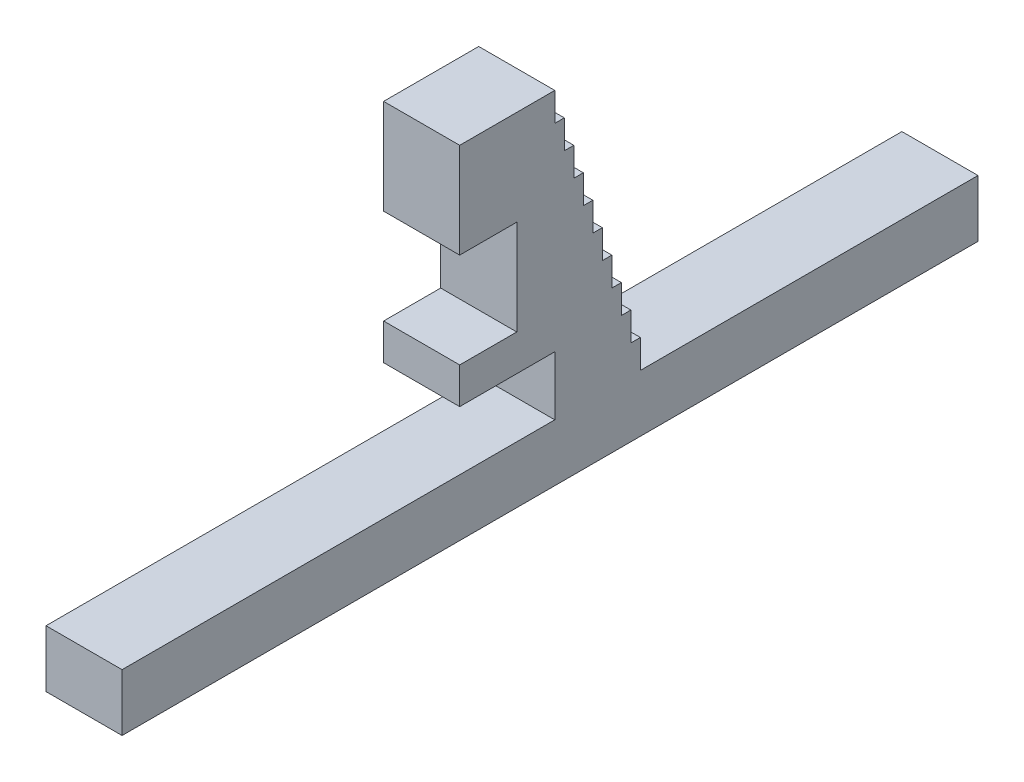
ISO-10303-21;
HEADER;
FILE_DESCRIPTION(('STEP AP214'),'2;1');
FILE_NAME('part.step','',(''),(''),'','','');
FILE_SCHEMA(('AUTOMOTIVE_DESIGN { 1 0 10303 214 1 1 1 1 }'));
ENDSEC;
DATA;
#1=APPLICATION_CONTEXT('core data for automotive mechanical design processes');
#2=APPLICATION_PROTOCOL_DEFINITION('international standard','automotive_design',2000,#1);
#3=PRODUCT_CONTEXT('',#1,'mechanical');
#4=PRODUCT('Part','Part','',(#3));
#5=PRODUCT_RELATED_PRODUCT_CATEGORY('part','',(#4));
#6=PRODUCT_DEFINITION_FORMATION('','',#4);
#7=PRODUCT_DEFINITION_CONTEXT('part definition',#1,'design');
#8=PRODUCT_DEFINITION('design','',#6,#7);
#9=PRODUCT_DEFINITION_SHAPE('','',#8);
#10=(LENGTH_UNIT() NAMED_UNIT(*) SI_UNIT(.MILLI.,.METRE.));
#11=(NAMED_UNIT(*) PLANE_ANGLE_UNIT() SI_UNIT($,.RADIAN.));
#12=(NAMED_UNIT(*) SI_UNIT($,.STERADIAN.) SOLID_ANGLE_UNIT());
#13=UNCERTAINTY_MEASURE_WITH_UNIT(LENGTH_MEASURE(1.E-05),#10,'distance_accuracy_value','');
#14=(GEOMETRIC_REPRESENTATION_CONTEXT(3) GLOBAL_UNCERTAINTY_ASSIGNED_CONTEXT((#13)) GLOBAL_UNIT_ASSIGNED_CONTEXT((#10,
#11,#12)) REPRESENTATION_CONTEXT('',''));
#15=CARTESIAN_POINT('',(0.,0.,0.));
#16=DIRECTION('',(0.,0.,1.));
#17=DIRECTION('',(1.,0.,0.));
#18=AXIS2_PLACEMENT_3D('',#15,#16,#17);
#19=CARTESIAN_POINT('',(4.,1.5,-4.));
#20=DIRECTION('',(0.,0.,1.));
#21=DIRECTION('',(0.,-1.,0.));
#22=AXIS2_PLACEMENT_3D('',#19,#20,#21);
#23=PLANE('',#22);
#24=DIRECTION('',(0.,1.,0.));
#25=VECTOR('',#24,1.);
#26=CARTESIAN_POINT('',(0.,1.5,-4.));
#27=LINE('',#26,#25);
#28=CARTESIAN_POINT('',(0.,0.,-4.));
#29=VERTEX_POINT('',#28);
#30=CARTESIAN_POINT('',(0.,1.5,-4.));
#31=VERTEX_POINT('',#30);
#32=EDGE_CURVE('E273',#29,#31,#27,.T.);
#33=ORIENTED_EDGE('',*,*,#32,.T.);
#34=DIRECTION('',(-1.,0.,0.));
#35=VECTOR('',#34,1.);
#36=CARTESIAN_POINT('',(4.,1.5,-4.));
#37=LINE('',#36,#35);
#38=CARTESIAN_POINT('',(4.,1.5,-4.));
#39=VERTEX_POINT('',#38);
#40=EDGE_CURVE('E11',#39,#31,#37,.T.);
#41=ORIENTED_EDGE('',*,*,#40,.F.);
#42=DIRECTION('',(0.,1.,0.));
#43=VECTOR('',#42,1.);
#44=CARTESIAN_POINT('',(4.,1.5,-4.));
#45=LINE('',#44,#43);
#46=CARTESIAN_POINT('',(4.,0.,-4.));
#47=VERTEX_POINT('',#46);
#48=EDGE_CURVE('E336',#47,#39,#45,.T.);
#49=ORIENTED_EDGE('',*,*,#48,.F.);
#50=DIRECTION('',(-1.,0.,0.));
#51=VECTOR('',#50,1.);
#52=CARTESIAN_POINT('',(4.,0.,-4.));
#53=LINE('',#52,#51);
#54=EDGE_CURVE('E269',#47,#29,#53,.T.);
#55=ORIENTED_EDGE('',*,*,#54,.T.);
#56=EDGE_LOOP('',(#33,#41,#49,#55));
#57=FACE_BOUND('',#56,.T.);
#58=ADVANCED_FACE('F33',(#57),#23,.F.);
#59=CARTESIAN_POINT('',(4.,1.5,-3.5));
#60=DIRECTION('',(0.,-1.,0.));
#61=DIRECTION('',(0.,0.,-1.));
#62=AXIS2_PLACEMENT_3D('',#59,#60,#61);
#63=PLANE('',#62);
#64=DIRECTION('',(0.,0.,1.));
#65=VECTOR('',#64,1.);
#66=CARTESIAN_POINT('',(0.,1.5,-3.5));
#67=LINE('',#66,#65);
#68=CARTESIAN_POINT('',(0.,1.5,-3.5));
#69=VERTEX_POINT('',#68);
#70=EDGE_CURVE('E276',#31,#69,#67,.T.);
#71=ORIENTED_EDGE('',*,*,#70,.T.);
#72=DIRECTION('',(-1.,0.,0.));
#73=VECTOR('',#72,1.);
#74=CARTESIAN_POINT('',(4.,1.5,-3.5));
#75=LINE('',#74,#73);
#76=CARTESIAN_POINT('',(4.,1.5,-3.5));
#77=VERTEX_POINT('',#76);
#78=EDGE_CURVE('E41',#77,#69,#75,.T.);
#79=ORIENTED_EDGE('',*,*,#78,.F.);
#80=DIRECTION('',(0.,0.,1.));
#81=VECTOR('',#80,1.);
#82=CARTESIAN_POINT('',(4.,1.5,-3.5));
#83=LINE('',#82,#81);
#84=EDGE_CURVE('E164',#39,#77,#83,.T.);
#85=ORIENTED_EDGE('',*,*,#84,.F.);
#86=ORIENTED_EDGE('',*,*,#40,.T.);
#87=EDGE_LOOP('',(#71,#79,#85,#86));
#88=FACE_BOUND('',#87,.T.);
#89=ADVANCED_FACE('F513',(#88),#63,.F.);
#90=CARTESIAN_POINT('',(4.,3.,-3.5));
#91=DIRECTION('',(0.,0.,1.));
#92=DIRECTION('',(1.,0.,0.));
#93=AXIS2_PLACEMENT_3D('',#90,#91,#92);
#94=PLANE('',#93);
#95=DIRECTION('',(0.,1.,0.));
#96=VECTOR('',#95,1.);
#97=CARTESIAN_POINT('',(0.,3.,-3.5));
#98=LINE('',#97,#96);
#99=CARTESIAN_POINT('',(0.,3.,-3.5));
#100=VERTEX_POINT('',#99);
#101=EDGE_CURVE('E278',#69,#100,#98,.T.);
#102=ORIENTED_EDGE('',*,*,#101,.T.);
#103=DIRECTION('',(-1.,0.,0.));
#104=VECTOR('',#103,1.);
#105=CARTESIAN_POINT('',(4.,3.,-3.5));
#106=LINE('',#105,#104);
#107=CARTESIAN_POINT('',(4.,3.,-3.5));
#108=VERTEX_POINT('',#107);
#109=EDGE_CURVE('E415',#108,#100,#106,.T.);
#110=ORIENTED_EDGE('',*,*,#109,.F.);
#111=DIRECTION('',(0.,1.,0.));
#112=VECTOR('',#111,1.);
#113=CARTESIAN_POINT('',(4.,3.,-3.5));
#114=LINE('',#113,#112);
#115=EDGE_CURVE('E423',#77,#108,#114,.T.);
#116=ORIENTED_EDGE('',*,*,#115,.F.);
#117=ORIENTED_EDGE('',*,*,#78,.T.);
#118=EDGE_LOOP('',(#102,#110,#116,#117));
#119=FACE_BOUND('',#118,.T.);
#120=ADVANCED_FACE('F421',(#119),#94,.F.);
#121=CARTESIAN_POINT('',(4.,3.,-3.));
#122=DIRECTION('',(0.,-1.,0.));
#123=DIRECTION('',(0.,0.,-1.));
#124=AXIS2_PLACEMENT_3D('',#121,#122,#123);
#125=PLANE('',#124);
#126=DIRECTION('',(0.,0.,1.));
#127=VECTOR('',#126,1.);
#128=CARTESIAN_POINT('',(0.,3.,-3.));
#129=LINE('',#128,#127);
#130=CARTESIAN_POINT('',(0.,3.,-3.));
#131=VERTEX_POINT('',#130);
#132=EDGE_CURVE('E280',#100,#131,#129,.T.);
#133=ORIENTED_EDGE('',*,*,#132,.T.);
#134=DIRECTION('',(-1.,0.,0.));
#135=VECTOR('',#134,1.);
#136=CARTESIAN_POINT('',(4.,3.,-3.));
#137=LINE('',#136,#135);
#138=CARTESIAN_POINT('',(4.,3.,-3.));
#139=VERTEX_POINT('',#138);
#140=EDGE_CURVE('E412',#139,#131,#137,.T.);
#141=ORIENTED_EDGE('',*,*,#140,.F.);
#142=DIRECTION('',(0.,0.,1.));
#143=VECTOR('',#142,1.);
#144=CARTESIAN_POINT('',(4.,3.,-3.));
#145=LINE('',#144,#143);
#146=EDGE_CURVE('E441',#108,#139,#145,.T.);
#147=ORIENTED_EDGE('',*,*,#146,.F.);
#148=ORIENTED_EDGE('',*,*,#109,.T.);
#149=EDGE_LOOP('',(#133,#141,#147,#148));
#150=FACE_BOUND('',#149,.T.);
#151=ADVANCED_FACE('F432',(#150),#125,.F.);
#152=CARTESIAN_POINT('',(4.,4.5,-3.));
#153=DIRECTION('',(0.,0.,1.));
#154=DIRECTION('',(0.,-1.,0.));
#155=AXIS2_PLACEMENT_3D('',#152,#153,#154);
#156=PLANE('',#155);
#157=DIRECTION('',(0.,1.,0.));
#158=VECTOR('',#157,1.);
#159=CARTESIAN_POINT('',(0.,4.5,-3.));
#160=LINE('',#159,#158);
#161=CARTESIAN_POINT('',(0.,4.5,-3.));
#162=VERTEX_POINT('',#161);
#163=EDGE_CURVE('E282',#131,#162,#160,.T.);
#164=ORIENTED_EDGE('',*,*,#163,.T.);
#165=DIRECTION('',(-1.,0.,0.));
#166=VECTOR('',#165,1.);
#167=CARTESIAN_POINT('',(4.,4.5,-3.));
#168=LINE('',#167,#166);
#169=CARTESIAN_POINT('',(4.,4.5,-3.));
#170=VERTEX_POINT('',#169);
#171=EDGE_CURVE('E409',#170,#162,#168,.T.);
#172=ORIENTED_EDGE('',*,*,#171,.F.);
#173=DIRECTION('',(0.,1.,0.));
#174=VECTOR('',#173,1.);
#175=CARTESIAN_POINT('',(4.,4.5,-3.));
#176=LINE('',#175,#174);
#177=EDGE_CURVE('E438',#139,#170,#176,.T.);
#178=ORIENTED_EDGE('',*,*,#177,.F.);
#179=ORIENTED_EDGE('',*,*,#140,.T.);
#180=EDGE_LOOP('',(#164,#172,#178,#179));
#181=FACE_BOUND('',#180,.T.);
#182=ADVANCED_FACE('F436',(#181),#156,.F.);
#183=CARTESIAN_POINT('',(4.,4.5,-2.5));
#184=DIRECTION('',(0.,-1.,0.));
#185=DIRECTION('',(0.,0.,-1.));
#186=AXIS2_PLACEMENT_3D('',#183,#184,#185);
#187=PLANE('',#186);
#188=DIRECTION('',(0.,0.,1.));
#189=VECTOR('',#188,1.);
#190=CARTESIAN_POINT('',(0.,4.5,-2.5));
#191=LINE('',#190,#189);
#192=CARTESIAN_POINT('',(0.,4.5,-2.5));
#193=VERTEX_POINT('',#192);
#194=EDGE_CURVE('E284',#162,#193,#191,.T.);
#195=ORIENTED_EDGE('',*,*,#194,.T.);
#196=DIRECTION('',(-1.,0.,0.));
#197=VECTOR('',#196,1.);
#198=CARTESIAN_POINT('',(4.,4.5,-2.5));
#199=LINE('',#198,#197);
#200=CARTESIAN_POINT('',(4.,4.5,-2.5));
#201=VERTEX_POINT('',#200);
#202=EDGE_CURVE('E406',#201,#193,#199,.T.);
#203=ORIENTED_EDGE('',*,*,#202,.F.);
#204=DIRECTION('',(0.,0.,1.));
#205=VECTOR('',#204,1.);
#206=CARTESIAN_POINT('',(4.,4.5,-2.5));
#207=LINE('',#206,#205);
#208=EDGE_CURVE('E440',#170,#201,#207,.T.);
#209=ORIENTED_EDGE('',*,*,#208,.F.);
#210=ORIENTED_EDGE('',*,*,#171,.T.);
#211=EDGE_LOOP('',(#195,#203,#209,#210));
#212=FACE_BOUND('',#211,.T.);
#213=ADVANCED_FACE('F526',(#212),#187,.F.);
#214=CARTESIAN_POINT('',(4.,6.,-2.5));
#215=DIRECTION('',(0.,0.,1.));
#216=DIRECTION('',(0.,-1.,0.));
#217=AXIS2_PLACEMENT_3D('',#214,#215,#216);
#218=PLANE('',#217);
#219=DIRECTION('',(0.,1.,0.));
#220=VECTOR('',#219,1.);
#221=CARTESIAN_POINT('',(0.,6.,-2.5));
#222=LINE('',#221,#220);
#223=CARTESIAN_POINT('',(0.,6.,-2.5));
#224=VERTEX_POINT('',#223);
#225=EDGE_CURVE('E286',#193,#224,#222,.T.);
#226=ORIENTED_EDGE('',*,*,#225,.T.);
#227=DIRECTION('',(-1.,0.,0.));
#228=VECTOR('',#227,1.);
#229=CARTESIAN_POINT('',(4.,6.,-2.5));
#230=LINE('',#229,#228);
#231=CARTESIAN_POINT('',(4.,6.,-2.5));
#232=VERTEX_POINT('',#231);
#233=EDGE_CURVE('E403',#232,#224,#230,.T.);
#234=ORIENTED_EDGE('',*,*,#233,.F.);
#235=DIRECTION('',(0.,1.,0.));
#236=VECTOR('',#235,1.);
#237=CARTESIAN_POINT('',(4.,6.,-2.5));
#238=LINE('',#237,#236);
#239=EDGE_CURVE('E443',#201,#232,#238,.T.);
#240=ORIENTED_EDGE('',*,*,#239,.F.);
#241=ORIENTED_EDGE('',*,*,#202,.T.);
#242=EDGE_LOOP('',(#226,#234,#240,#241));
#243=FACE_BOUND('',#242,.T.);
#244=ADVANCED_FACE('F529',(#243),#218,.F.);
#245=CARTESIAN_POINT('',(4.,6.,-2.));
#246=DIRECTION('',(0.,-1.,0.));
#247=DIRECTION('',(0.,0.,-1.));
#248=AXIS2_PLACEMENT_3D('',#245,#246,#247);
#249=PLANE('',#248);
#250=DIRECTION('',(0.,0.,1.));
#251=VECTOR('',#250,1.);
#252=CARTESIAN_POINT('',(0.,6.,-2.));
#253=LINE('',#252,#251);
#254=CARTESIAN_POINT('',(0.,6.,-2.));
#255=VERTEX_POINT('',#254);
#256=EDGE_CURVE('E288',#224,#255,#253,.T.);
#257=ORIENTED_EDGE('',*,*,#256,.T.);
#258=DIRECTION('',(-1.,0.,0.));
#259=VECTOR('',#258,1.);
#260=CARTESIAN_POINT('',(4.,6.,-2.));
#261=LINE('',#260,#259);
#262=CARTESIAN_POINT('',(4.,6.,-2.));
#263=VERTEX_POINT('',#262);
#264=EDGE_CURVE('E400',#263,#255,#261,.T.);
#265=ORIENTED_EDGE('',*,*,#264,.F.);
#266=DIRECTION('',(0.,0.,1.));
#267=VECTOR('',#266,1.);
#268=CARTESIAN_POINT('',(4.,6.,-2.));
#269=LINE('',#268,#267);
#270=EDGE_CURVE('E449',#232,#263,#269,.T.);
#271=ORIENTED_EDGE('',*,*,#270,.F.);
#272=ORIENTED_EDGE('',*,*,#233,.T.);
#273=EDGE_LOOP('',(#257,#265,#271,#272));
#274=FACE_BOUND('',#273,.T.);
#275=ADVANCED_FACE('F533',(#274),#249,.F.);
#276=CARTESIAN_POINT('',(4.,7.5,-2.));
#277=DIRECTION('',(0.,0.,1.));
#278=DIRECTION('',(0.,-1.,0.));
#279=AXIS2_PLACEMENT_3D('',#276,#277,#278);
#280=PLANE('',#279);
#281=DIRECTION('',(0.,1.,0.));
#282=VECTOR('',#281,1.);
#283=CARTESIAN_POINT('',(0.,7.5,-2.));
#284=LINE('',#283,#282);
#285=CARTESIAN_POINT('',(0.,7.5,-2.));
#286=VERTEX_POINT('',#285);
#287=EDGE_CURVE('E290',#255,#286,#284,.T.);
#288=ORIENTED_EDGE('',*,*,#287,.T.);
#289=DIRECTION('',(-1.,0.,0.));
#290=VECTOR('',#289,1.);
#291=CARTESIAN_POINT('',(4.,7.5,-2.));
#292=LINE('',#291,#290);
#293=CARTESIAN_POINT('',(4.,7.5,-2.));
#294=VERTEX_POINT('',#293);
#295=EDGE_CURVE('E397',#294,#286,#292,.T.);
#296=ORIENTED_EDGE('',*,*,#295,.F.);
#297=DIRECTION('',(0.,1.,0.));
#298=VECTOR('',#297,1.);
#299=CARTESIAN_POINT('',(4.,7.5,-2.));
#300=LINE('',#299,#298);
#301=EDGE_CURVE('E451',#263,#294,#300,.T.);
#302=ORIENTED_EDGE('',*,*,#301,.F.);
#303=ORIENTED_EDGE('',*,*,#264,.T.);
#304=EDGE_LOOP('',(#288,#296,#302,#303));
#305=FACE_BOUND('',#304,.T.);
#306=ADVANCED_FACE('F537',(#305),#280,.F.);
#307=CARTESIAN_POINT('',(4.,7.5,-1.5));
#308=DIRECTION('',(0.,-1.,0.));
#309=DIRECTION('',(0.,0.,-1.));
#310=AXIS2_PLACEMENT_3D('',#307,#308,#309);
#311=PLANE('',#310);
#312=DIRECTION('',(0.,0.,1.));
#313=VECTOR('',#312,1.);
#314=CARTESIAN_POINT('',(0.,7.5,-1.5));
#315=LINE('',#314,#313);
#316=CARTESIAN_POINT('',(0.,7.5,-1.5));
#317=VERTEX_POINT('',#316);
#318=EDGE_CURVE('E292',#286,#317,#315,.T.);
#319=ORIENTED_EDGE('',*,*,#318,.T.);
#320=DIRECTION('',(-1.,0.,0.));
#321=VECTOR('',#320,1.);
#322=CARTESIAN_POINT('',(4.,7.5,-1.5));
#323=LINE('',#322,#321);
#324=CARTESIAN_POINT('',(4.,7.5,-1.5));
#325=VERTEX_POINT('',#324);
#326=EDGE_CURVE('E394',#325,#317,#323,.T.);
#327=ORIENTED_EDGE('',*,*,#326,.F.);
#328=DIRECTION('',(0.,0.,1.));
#329=VECTOR('',#328,1.);
#330=CARTESIAN_POINT('',(4.,7.5,-1.5));
#331=LINE('',#330,#329);
#332=EDGE_CURVE('E453',#294,#325,#331,.T.);
#333=ORIENTED_EDGE('',*,*,#332,.F.);
#334=ORIENTED_EDGE('',*,*,#295,.T.);
#335=EDGE_LOOP('',(#319,#327,#333,#334));
#336=FACE_BOUND('',#335,.T.);
#337=ADVANCED_FACE('F541',(#336),#311,.F.);
#338=CARTESIAN_POINT('',(4.,9.,-1.5));
#339=DIRECTION('',(0.,0.,1.));
#340=DIRECTION('',(0.,-1.,0.));
#341=AXIS2_PLACEMENT_3D('',#338,#339,#340);
#342=PLANE('',#341);
#343=DIRECTION('',(0.,1.,0.));
#344=VECTOR('',#343,1.);
#345=CARTESIAN_POINT('',(0.,9.,-1.5));
#346=LINE('',#345,#344);
#347=CARTESIAN_POINT('',(0.,9.,-1.5));
#348=VERTEX_POINT('',#347);
#349=EDGE_CURVE('E294',#317,#348,#346,.T.);
#350=ORIENTED_EDGE('',*,*,#349,.T.);
#351=DIRECTION('',(-1.,0.,0.));
#352=VECTOR('',#351,1.);
#353=CARTESIAN_POINT('',(4.,9.,-1.5));
#354=LINE('',#353,#352);
#355=CARTESIAN_POINT('',(4.,9.,-1.5));
#356=VERTEX_POINT('',#355);
#357=EDGE_CURVE('E391',#356,#348,#354,.T.);
#358=ORIENTED_EDGE('',*,*,#357,.F.);
#359=DIRECTION('',(0.,1.,0.));
#360=VECTOR('',#359,1.);
#361=CARTESIAN_POINT('',(4.,9.,-1.5));
#362=LINE('',#361,#360);
#363=EDGE_CURVE('E455',#325,#356,#362,.T.);
#364=ORIENTED_EDGE('',*,*,#363,.F.);
#365=ORIENTED_EDGE('',*,*,#326,.T.);
#366=EDGE_LOOP('',(#350,#358,#364,#365));
#367=FACE_BOUND('',#366,.T.);
#368=ADVANCED_FACE('F545',(#367),#342,.F.);
#369=CARTESIAN_POINT('',(4.,9.,-1.));
#370=DIRECTION('',(0.,-1.,0.));
#371=DIRECTION('',(0.,0.,-1.));
#372=AXIS2_PLACEMENT_3D('',#369,#370,#371);
#373=PLANE('',#372);
#374=DIRECTION('',(0.,0.,1.));
#375=VECTOR('',#374,1.);
#376=CARTESIAN_POINT('',(0.,9.,-1.));
#377=LINE('',#376,#375);
#378=CARTESIAN_POINT('',(0.,9.,-1.));
#379=VERTEX_POINT('',#378);
#380=EDGE_CURVE('E296',#348,#379,#377,.T.);
#381=ORIENTED_EDGE('',*,*,#380,.T.);
#382=DIRECTION('',(-1.,0.,0.));
#383=VECTOR('',#382,1.);
#384=CARTESIAN_POINT('',(4.,9.,-1.));
#385=LINE('',#384,#383);
#386=CARTESIAN_POINT('',(4.,9.,-1.));
#387=VERTEX_POINT('',#386);
#388=EDGE_CURVE('E388',#387,#379,#385,.T.);
#389=ORIENTED_EDGE('',*,*,#388,.F.);
#390=DIRECTION('',(0.,0.,1.));
#391=VECTOR('',#390,1.);
#392=CARTESIAN_POINT('',(4.,9.,-1.));
#393=LINE('',#392,#391);
#394=EDGE_CURVE('E457',#356,#387,#393,.T.);
#395=ORIENTED_EDGE('',*,*,#394,.F.);
#396=ORIENTED_EDGE('',*,*,#357,.T.);
#397=EDGE_LOOP('',(#381,#389,#395,#396));
#398=FACE_BOUND('',#397,.T.);
#399=ADVANCED_FACE('F549',(#398),#373,.F.);
#400=CARTESIAN_POINT('',(4.,10.5,-1.));
#401=DIRECTION('',(0.,0.,1.));
#402=DIRECTION('',(1.,0.,0.));
#403=AXIS2_PLACEMENT_3D('',#400,#401,#402);
#404=PLANE('',#403);
#405=DIRECTION('',(0.,1.,0.));
#406=VECTOR('',#405,1.);
#407=CARTESIAN_POINT('',(0.,10.5,-1.));
#408=LINE('',#407,#406);
#409=CARTESIAN_POINT('',(0.,10.5,-1.));
#410=VERTEX_POINT('',#409);
#411=EDGE_CURVE('E298',#379,#410,#408,.T.);
#412=ORIENTED_EDGE('',*,*,#411,.T.);
#413=DIRECTION('',(-1.,0.,0.));
#414=VECTOR('',#413,1.);
#415=CARTESIAN_POINT('',(4.,10.5,-1.));
#416=LINE('',#415,#414);
#417=CARTESIAN_POINT('',(4.,10.5,-1.));
#418=VERTEX_POINT('',#417);
#419=EDGE_CURVE('E385',#418,#410,#416,.T.);
#420=ORIENTED_EDGE('',*,*,#419,.F.);
#421=DIRECTION('',(0.,1.,0.));
#422=VECTOR('',#421,1.);
#423=CARTESIAN_POINT('',(4.,10.5,-1.));
#424=LINE('',#423,#422);
#425=EDGE_CURVE('E459',#387,#418,#424,.T.);
#426=ORIENTED_EDGE('',*,*,#425,.F.);
#427=ORIENTED_EDGE('',*,*,#388,.T.);
#428=EDGE_LOOP('',(#412,#420,#426,#427));
#429=FACE_BOUND('',#428,.T.);
#430=ADVANCED_FACE('F553',(#429),#404,.F.);
#431=CARTESIAN_POINT('',(4.,10.5,-0.5));
#432=DIRECTION('',(0.,-1.,0.));
#433=DIRECTION('',(0.,0.,-1.));
#434=AXIS2_PLACEMENT_3D('',#431,#432,#433);
#435=PLANE('',#434);
#436=DIRECTION('',(0.,0.,1.));
#437=VECTOR('',#436,1.);
#438=CARTESIAN_POINT('',(0.,10.5,-0.5));
#439=LINE('',#438,#437);
#440=CARTESIAN_POINT('',(0.,10.5,-0.5));
#441=VERTEX_POINT('',#440);
#442=EDGE_CURVE('E300',#410,#441,#439,.T.);
#443=ORIENTED_EDGE('',*,*,#442,.T.);
#444=DIRECTION('',(-1.,0.,0.));
#445=VECTOR('',#444,1.);
#446=CARTESIAN_POINT('',(4.,10.5,-0.5));
#447=LINE('',#446,#445);
#448=CARTESIAN_POINT('',(4.,10.5,-0.5));
#449=VERTEX_POINT('',#448);
#450=EDGE_CURVE('E382',#449,#441,#447,.T.);
#451=ORIENTED_EDGE('',*,*,#450,.F.);
#452=DIRECTION('',(0.,0.,1.));
#453=VECTOR('',#452,1.);
#454=CARTESIAN_POINT('',(4.,10.5,-0.5));
#455=LINE('',#454,#453);
#456=EDGE_CURVE('E461',#418,#449,#455,.T.);
#457=ORIENTED_EDGE('',*,*,#456,.F.);
#458=ORIENTED_EDGE('',*,*,#419,.T.);
#459=EDGE_LOOP('',(#443,#451,#457,#458));
#460=FACE_BOUND('',#459,.T.);
#461=ADVANCED_FACE('F557',(#460),#435,.F.);
#462=CARTESIAN_POINT('',(4.,12.,-0.5));
#463=DIRECTION('',(0.,0.,1.));
#464=DIRECTION('',(1.,0.,0.));
#465=AXIS2_PLACEMENT_3D('',#462,#463,#464);
#466=PLANE('',#465);
#467=DIRECTION('',(0.,1.,0.));
#468=VECTOR('',#467,1.);
#469=CARTESIAN_POINT('',(0.,12.,-0.5));
#470=LINE('',#469,#468);
#471=CARTESIAN_POINT('',(0.,12.,-0.5));
#472=VERTEX_POINT('',#471);
#473=EDGE_CURVE('E302',#441,#472,#470,.T.);
#474=ORIENTED_EDGE('',*,*,#473,.T.);
#475=DIRECTION('',(-1.,0.,0.));
#476=VECTOR('',#475,1.);
#477=CARTESIAN_POINT('',(4.,12.,-0.5));
#478=LINE('',#477,#476);
#479=CARTESIAN_POINT('',(4.,12.,-0.5));
#480=VERTEX_POINT('',#479);
#481=EDGE_CURVE('E379',#480,#472,#478,.T.);
#482=ORIENTED_EDGE('',*,*,#481,.F.);
#483=DIRECTION('',(0.,1.,0.));
#484=VECTOR('',#483,1.);
#485=CARTESIAN_POINT('',(4.,12.,-0.5));
#486=LINE('',#485,#484);
#487=EDGE_CURVE('E463',#449,#480,#486,.T.);
#488=ORIENTED_EDGE('',*,*,#487,.F.);
#489=ORIENTED_EDGE('',*,*,#450,.T.);
#490=EDGE_LOOP('',(#474,#482,#488,#489));
#491=FACE_BOUND('',#490,.T.);
#492=ADVANCED_FACE('F561',(#491),#466,.F.);
#493=CARTESIAN_POINT('',(4.,12.,0.));
#494=DIRECTION('',(0.,-1.,0.));
#495=DIRECTION('',(0.,0.,-1.));
#496=AXIS2_PLACEMENT_3D('',#493,#494,#495);
#497=PLANE('',#496);
#498=DIRECTION('',(0.,0.,1.));
#499=VECTOR('',#498,1.);
#500=CARTESIAN_POINT('',(0.,12.,0.));
#501=LINE('',#500,#499);
#502=CARTESIAN_POINT('',(0.,12.,0.));
#503=VERTEX_POINT('',#502);
#504=EDGE_CURVE('E304',#472,#503,#501,.T.);
#505=ORIENTED_EDGE('',*,*,#504,.T.);
#506=DIRECTION('',(-1.,0.,0.));
#507=VECTOR('',#506,1.);
#508=CARTESIAN_POINT('',(4.,12.,0.));
#509=LINE('',#508,#507);
#510=CARTESIAN_POINT('',(4.,12.,0.));
#511=VERTEX_POINT('',#510);
#512=EDGE_CURVE('E376',#511,#503,#509,.T.);
#513=ORIENTED_EDGE('',*,*,#512,.F.);
#514=DIRECTION('',(0.,0.,1.));
#515=VECTOR('',#514,1.);
#516=CARTESIAN_POINT('',(4.,12.,0.));
#517=LINE('',#516,#515);
#518=EDGE_CURVE('E465',#480,#511,#517,.T.);
#519=ORIENTED_EDGE('',*,*,#518,.F.);
#520=ORIENTED_EDGE('',*,*,#481,.T.);
#521=EDGE_LOOP('',(#505,#513,#519,#520));
#522=FACE_BOUND('',#521,.T.);
#523=ADVANCED_FACE('F565',(#522),#497,.F.);
#524=CARTESIAN_POINT('',(4.,13.5,0.));
#525=DIRECTION('',(0.,0.,1.));
#526=DIRECTION('',(1.,0.,0.));
#527=AXIS2_PLACEMENT_3D('',#524,#525,#526);
#528=PLANE('',#527);
#529=DIRECTION('',(0.,1.,0.));
#530=VECTOR('',#529,1.);
#531=CARTESIAN_POINT('',(0.,13.5,0.));
#532=LINE('',#531,#530);
#533=CARTESIAN_POINT('',(0.,13.5,0.));
#534=VERTEX_POINT('',#533);
#535=EDGE_CURVE('E306',#503,#534,#532,.T.);
#536=ORIENTED_EDGE('',*,*,#535,.T.);
#537=DIRECTION('',(-1.,0.,0.));
#538=VECTOR('',#537,1.);
#539=CARTESIAN_POINT('',(4.,13.5,0.));
#540=LINE('',#539,#538);
#541=CARTESIAN_POINT('',(4.,13.5,0.));
#542=VERTEX_POINT('',#541);
#543=EDGE_CURVE('E373',#542,#534,#540,.T.);
#544=ORIENTED_EDGE('',*,*,#543,.F.);
#545=DIRECTION('',(0.,1.,0.));
#546=VECTOR('',#545,1.);
#547=CARTESIAN_POINT('',(4.,13.5,0.));
#548=LINE('',#547,#546);
#549=EDGE_CURVE('E467',#511,#542,#548,.T.);
#550=ORIENTED_EDGE('',*,*,#549,.F.);
#551=ORIENTED_EDGE('',*,*,#512,.T.);
#552=EDGE_LOOP('',(#536,#544,#550,#551));
#553=FACE_BOUND('',#552,.T.);
#554=ADVANCED_FACE('F569',(#553),#528,.F.);
#555=CARTESIAN_POINT('',(4.,13.5,0.5));
#556=DIRECTION('',(0.,-1.,0.));
#557=DIRECTION('',(0.,0.,-1.));
#558=AXIS2_PLACEMENT_3D('',#555,#556,#557);
#559=PLANE('',#558);
#560=DIRECTION('',(0.,0.,1.));
#561=VECTOR('',#560,1.);
#562=CARTESIAN_POINT('',(0.,13.5,0.5));
#563=LINE('',#562,#561);
#564=CARTESIAN_POINT('',(0.,13.5,0.5));
#565=VERTEX_POINT('',#564);
#566=EDGE_CURVE('E308',#534,#565,#563,.T.);
#567=ORIENTED_EDGE('',*,*,#566,.T.);
#568=DIRECTION('',(-1.,0.,0.));
#569=VECTOR('',#568,1.);
#570=CARTESIAN_POINT('',(4.,13.5,0.5));
#571=LINE('',#570,#569);
#572=CARTESIAN_POINT('',(4.,13.5,0.5));
#573=VERTEX_POINT('',#572);
#574=EDGE_CURVE('E370',#573,#565,#571,.T.);
#575=ORIENTED_EDGE('',*,*,#574,.F.);
#576=DIRECTION('',(0.,0.,1.));
#577=VECTOR('',#576,1.);
#578=CARTESIAN_POINT('',(4.,13.5,0.5));
#579=LINE('',#578,#577);
#580=EDGE_CURVE('E469',#542,#573,#579,.T.);
#581=ORIENTED_EDGE('',*,*,#580,.F.);
#582=ORIENTED_EDGE('',*,*,#543,.T.);
#583=EDGE_LOOP('',(#567,#575,#581,#582));
#584=FACE_BOUND('',#583,.T.);
#585=ADVANCED_FACE('F573',(#584),#559,.F.);
#586=CARTESIAN_POINT('',(4.,15.,0.5));
#587=DIRECTION('',(0.,0.,1.));
#588=DIRECTION('',(1.,0.,0.));
#589=AXIS2_PLACEMENT_3D('',#586,#587,#588);
#590=PLANE('',#589);
#591=DIRECTION('',(0.,1.,0.));
#592=VECTOR('',#591,1.);
#593=CARTESIAN_POINT('',(0.,15.,0.5));
#594=LINE('',#593,#592);
#595=CARTESIAN_POINT('',(0.,15.,0.5));
#596=VERTEX_POINT('',#595);
#597=EDGE_CURVE('E310',#565,#596,#594,.T.);
#598=ORIENTED_EDGE('',*,*,#597,.T.);
#599=DIRECTION('',(-1.,0.,0.));
#600=VECTOR('',#599,1.);
#601=CARTESIAN_POINT('',(4.,15.,0.5));
#602=LINE('',#601,#600);
#603=CARTESIAN_POINT('',(4.,15.,0.5));
#604=VERTEX_POINT('',#603);
#605=EDGE_CURVE('E367',#604,#596,#602,.T.);
#606=ORIENTED_EDGE('',*,*,#605,.F.);
#607=DIRECTION('',(0.,1.,0.));
#608=VECTOR('',#607,1.);
#609=CARTESIAN_POINT('',(4.,15.,0.5));
#610=LINE('',#609,#608);
#611=EDGE_CURVE('E471',#573,#604,#610,.T.);
#612=ORIENTED_EDGE('',*,*,#611,.F.);
#613=ORIENTED_EDGE('',*,*,#574,.T.);
#614=EDGE_LOOP('',(#598,#606,#612,#613));
#615=FACE_BOUND('',#614,.T.);
#616=ADVANCED_FACE('F577',(#615),#590,.F.);
#617=CARTESIAN_POINT('',(4.,15.,5.5));
#618=DIRECTION('',(0.,-1.,0.));
#619=DIRECTION('',(0.,0.,-1.));
#620=AXIS2_PLACEMENT_3D('',#617,#618,#619);
#621=PLANE('',#620);
#622=DIRECTION('',(0.,0.,1.));
#623=VECTOR('',#622,1.);
#624=CARTESIAN_POINT('',(0.,15.,5.5));
#625=LINE('',#624,#623);
#626=CARTESIAN_POINT('',(0.,15.,5.5));
#627=VERTEX_POINT('',#626);
#628=EDGE_CURVE('E312',#596,#627,#625,.T.);
#629=ORIENTED_EDGE('',*,*,#628,.T.);
#630=DIRECTION('',(-1.,0.,0.));
#631=VECTOR('',#630,1.);
#632=CARTESIAN_POINT('',(4.,15.,5.5));
#633=LINE('',#632,#631);
#634=CARTESIAN_POINT('',(4.,15.,5.5));
#635=VERTEX_POINT('',#634);
#636=EDGE_CURVE('E364',#635,#627,#633,.T.);
#637=ORIENTED_EDGE('',*,*,#636,.F.);
#638=DIRECTION('',(0.,0.,1.));
#639=VECTOR('',#638,1.);
#640=CARTESIAN_POINT('',(4.,15.,5.5));
#641=LINE('',#640,#639);
#642=EDGE_CURVE('E473',#604,#635,#641,.T.);
#643=ORIENTED_EDGE('',*,*,#642,.F.);
#644=ORIENTED_EDGE('',*,*,#605,.T.);
#645=EDGE_LOOP('',(#629,#637,#643,#644));
#646=FACE_BOUND('',#645,.T.);
#647=ADVANCED_FACE('F581',(#646),#621,.F.);
#648=CARTESIAN_POINT('',(4.,15.,5.5));
#649=DIRECTION('',(0.,0.,-1.));
#650=DIRECTION('',(0.,1.,0.));
#651=AXIS2_PLACEMENT_3D('',#648,#649,#650);
#652=PLANE('',#651);
#653=DIRECTION('',(0.,-1.,0.));
#654=VECTOR('',#653,1.);
#655=CARTESIAN_POINT('',(0.,15.,5.5));
#656=LINE('',#655,#654);
#657=CARTESIAN_POINT('',(0.,9.99999999999999,5.50000000000001));
#658=VERTEX_POINT('',#657);
#659=EDGE_CURVE('E314',#627,#658,#656,.T.);
#660=ORIENTED_EDGE('',*,*,#659,.T.);
#661=DIRECTION('',(-1.,0.,0.));
#662=VECTOR('',#661,1.);
#663=CARTESIAN_POINT('',(4.,9.99999999999999,5.50000000000001));
#664=LINE('',#663,#662);
#665=CARTESIAN_POINT('',(4.,9.99999999999999,5.50000000000001));
#666=VERTEX_POINT('',#665);
#667=EDGE_CURVE('E361',#666,#658,#664,.T.);
#668=ORIENTED_EDGE('',*,*,#667,.F.);
#669=DIRECTION('',(0.,-1.,0.));
#670=VECTOR('',#669,1.);
#671=CARTESIAN_POINT('',(4.,15.,5.5));
#672=LINE('',#671,#670);
#673=EDGE_CURVE('E475',#635,#666,#672,.T.);
#674=ORIENTED_EDGE('',*,*,#673,.F.);
#675=ORIENTED_EDGE('',*,*,#636,.T.);
#676=EDGE_LOOP('',(#660,#668,#674,#675));
#677=FACE_BOUND('',#676,.T.);
#678=ADVANCED_FACE('F585',(#677),#652,.F.);
#679=CARTESIAN_POINT('',(4.,9.99999999999999,2.50000000000001));
#680=DIRECTION('',(0.,1.,0.));
#681=DIRECTION('',(0.,0.,1.));
#682=AXIS2_PLACEMENT_3D('',#679,#680,#681);
#683=PLANE('',#682);
#684=DIRECTION('',(0.,0.,-1.));
#685=VECTOR('',#684,1.);
#686=CARTESIAN_POINT('',(0.,9.99999999999999,2.50000000000001));
#687=LINE('',#686,#685);
#688=CARTESIAN_POINT('',(0.,9.99999999999999,2.50000000000001));
#689=VERTEX_POINT('',#688);
#690=EDGE_CURVE('E316',#658,#689,#687,.T.);
#691=ORIENTED_EDGE('',*,*,#690,.T.);
#692=DIRECTION('',(-1.,0.,0.));
#693=VECTOR('',#692,1.);
#694=CARTESIAN_POINT('',(4.,9.99999999999999,2.50000000000001));
#695=LINE('',#694,#693);
#696=CARTESIAN_POINT('',(4.,9.99999999999999,2.50000000000001));
#697=VERTEX_POINT('',#696);
#698=EDGE_CURVE('E358',#697,#689,#695,.T.);
#699=ORIENTED_EDGE('',*,*,#698,.F.);
#700=DIRECTION('',(0.,0.,-1.));
#701=VECTOR('',#700,1.);
#702=CARTESIAN_POINT('',(4.,9.99999999999999,2.50000000000001));
#703=LINE('',#702,#701);
#704=EDGE_CURVE('E477',#666,#697,#703,.T.);
#705=ORIENTED_EDGE('',*,*,#704,.F.);
#706=ORIENTED_EDGE('',*,*,#667,.T.);
#707=EDGE_LOOP('',(#691,#699,#705,#706));
#708=FACE_BOUND('',#707,.T.);
#709=ADVANCED_FACE('F589',(#708),#683,.F.);
#710=CARTESIAN_POINT('',(4.,9.99999999999999,2.50000000000001));
#711=DIRECTION('',(0.,0.,-1.));
#712=DIRECTION('',(0.,1.,0.));
#713=AXIS2_PLACEMENT_3D('',#710,#711,#712);
#714=PLANE('',#713);
#715=DIRECTION('',(0.,-1.,0.));
#716=VECTOR('',#715,1.);
#717=CARTESIAN_POINT('',(0.,9.99999999999999,2.50000000000001));
#718=LINE('',#717,#716);
#719=CARTESIAN_POINT('',(0.,4.99999999999999,2.50000000000001));
#720=VERTEX_POINT('',#719);
#721=EDGE_CURVE('E318',#689,#720,#718,.T.);
#722=ORIENTED_EDGE('',*,*,#721,.T.);
#723=DIRECTION('',(-1.,0.,0.));
#724=VECTOR('',#723,1.);
#725=CARTESIAN_POINT('',(4.,4.99999999999999,2.50000000000001));
#726=LINE('',#725,#724);
#727=CARTESIAN_POINT('',(4.,4.99999999999999,2.50000000000001));
#728=VERTEX_POINT('',#727);
#729=EDGE_CURVE('E355',#728,#720,#726,.T.);
#730=ORIENTED_EDGE('',*,*,#729,.F.);
#731=DIRECTION('',(0.,-1.,0.));
#732=VECTOR('',#731,1.);
#733=CARTESIAN_POINT('',(4.,9.99999999999999,2.50000000000001));
#734=LINE('',#733,#732);
#735=EDGE_CURVE('E479',#697,#728,#734,.T.);
#736=ORIENTED_EDGE('',*,*,#735,.F.);
#737=ORIENTED_EDGE('',*,*,#698,.T.);
#738=EDGE_LOOP('',(#722,#730,#736,#737));
#739=FACE_BOUND('',#738,.T.);
#740=ADVANCED_FACE('F593',(#739),#714,.F.);
#741=CARTESIAN_POINT('',(4.,4.99999999999999,2.50000000000001));
#742=DIRECTION('',(0.,-1.,0.));
#743=DIRECTION('',(0.,0.,-1.));
#744=AXIS2_PLACEMENT_3D('',#741,#742,#743);
#745=PLANE('',#744);
#746=DIRECTION('',(0.,0.,1.));
#747=VECTOR('',#746,1.);
#748=CARTESIAN_POINT('',(0.,4.99999999999999,2.50000000000001));
#749=LINE('',#748,#747);
#750=CARTESIAN_POINT('',(0.,5.,5.50000000000001));
#751=VERTEX_POINT('',#750);
#752=EDGE_CURVE('E320',#720,#751,#749,.T.);
#753=ORIENTED_EDGE('',*,*,#752,.T.);
#754=DIRECTION('',(-1.,0.,0.));
#755=VECTOR('',#754,1.);
#756=CARTESIAN_POINT('',(4.,5.,5.50000000000001));
#757=LINE('',#756,#755);
#758=CARTESIAN_POINT('',(4.,5.,5.50000000000001));
#759=VERTEX_POINT('',#758);
#760=EDGE_CURVE('E352',#759,#751,#757,.T.);
#761=ORIENTED_EDGE('',*,*,#760,.F.);
#762=DIRECTION('',(0.,0.,1.));
#763=VECTOR('',#762,1.);
#764=CARTESIAN_POINT('',(4.,4.99999999999999,2.50000000000001));
#765=LINE('',#764,#763);
#766=EDGE_CURVE('E481',#728,#759,#765,.T.);
#767=ORIENTED_EDGE('',*,*,#766,.F.);
#768=ORIENTED_EDGE('',*,*,#729,.T.);
#769=EDGE_LOOP('',(#753,#761,#767,#768));
#770=FACE_BOUND('',#769,.T.);
#771=ADVANCED_FACE('F597',(#770),#745,.F.);
#772=CARTESIAN_POINT('',(4.,5.,5.50000000000001));
#773=DIRECTION('',(0.,0.,-1.));
#774=DIRECTION('',(-1.,0.,0.));
#775=AXIS2_PLACEMENT_3D('',#772,#773,#774);
#776=PLANE('',#775);
#777=DIRECTION('',(0.,-1.,0.));
#778=VECTOR('',#777,1.);
#779=CARTESIAN_POINT('',(0.,5.,5.50000000000001));
#780=LINE('',#779,#778);
#781=CARTESIAN_POINT('',(0.,3.1,5.50000000000001));
#782=VERTEX_POINT('',#781);
#783=EDGE_CURVE('E322',#751,#782,#780,.T.);
#784=ORIENTED_EDGE('',*,*,#783,.T.);
#785=DIRECTION('',(-1.,0.,0.));
#786=VECTOR('',#785,1.);
#787=CARTESIAN_POINT('',(4.,3.1,5.50000000000001));
#788=LINE('',#787,#786);
#789=CARTESIAN_POINT('',(4.,3.1,5.50000000000001));
#790=VERTEX_POINT('',#789);
#791=EDGE_CURVE('E349',#790,#782,#788,.T.);
#792=ORIENTED_EDGE('',*,*,#791,.F.);
#793=DIRECTION('',(0.,-1.,0.));
#794=VECTOR('',#793,1.);
#795=CARTESIAN_POINT('',(4.,5.,5.50000000000001));
#796=LINE('',#795,#794);
#797=EDGE_CURVE('E483',#759,#790,#796,.T.);
#798=ORIENTED_EDGE('',*,*,#797,.F.);
#799=ORIENTED_EDGE('',*,*,#760,.T.);
#800=EDGE_LOOP('',(#784,#792,#798,#799));
#801=FACE_BOUND('',#800,.T.);
#802=ADVANCED_FACE('F601',(#801),#776,.F.);
#803=CARTESIAN_POINT('',(4.,3.1,0.500000000000009));
#804=DIRECTION('',(0.,1.,0.));
#805=DIRECTION('',(0.,0.,1.));
#806=AXIS2_PLACEMENT_3D('',#803,#804,#805);
#807=PLANE('',#806);
#808=DIRECTION('',(0.,0.,-1.));
#809=VECTOR('',#808,1.);
#810=CARTESIAN_POINT('',(0.,3.1,0.500000000000009));
#811=LINE('',#810,#809);
#812=CARTESIAN_POINT('',(0.,3.1,0.500000000000009));
#813=VERTEX_POINT('',#812);
#814=EDGE_CURVE('E324',#782,#813,#811,.T.);
#815=ORIENTED_EDGE('',*,*,#814,.T.);
#816=DIRECTION('',(-1.,0.,0.));
#817=VECTOR('',#816,1.);
#818=CARTESIAN_POINT('',(4.,3.1,0.500000000000009));
#819=LINE('',#818,#817);
#820=CARTESIAN_POINT('',(4.,3.1,0.500000000000009));
#821=VERTEX_POINT('',#820);
#822=EDGE_CURVE('E346',#821,#813,#819,.T.);
#823=ORIENTED_EDGE('',*,*,#822,.F.);
#824=DIRECTION('',(0.,0.,-1.));
#825=VECTOR('',#824,1.);
#826=CARTESIAN_POINT('',(4.,3.1,0.500000000000009));
#827=LINE('',#826,#825);
#828=EDGE_CURVE('E485',#790,#821,#827,.T.);
#829=ORIENTED_EDGE('',*,*,#828,.F.);
#830=ORIENTED_EDGE('',*,*,#791,.T.);
#831=EDGE_LOOP('',(#815,#823,#829,#830));
#832=FACE_BOUND('',#831,.T.);
#833=ADVANCED_FACE('F605',(#832),#807,.F.);
#834=CARTESIAN_POINT('',(4.,0.,0.500000000000009));
#835=DIRECTION('',(0.,0.,-1.));
#836=DIRECTION('',(-1.,0.,0.));
#837=AXIS2_PLACEMENT_3D('',#834,#835,#836);
#838=PLANE('',#837);
#839=DIRECTION('',(0.,-1.,0.));
#840=VECTOR('',#839,1.);
#841=CARTESIAN_POINT('',(0.,0.,0.500000000000009));
#842=LINE('',#841,#840);
#843=CARTESIAN_POINT('',(0.,0.,0.500000000000009));
#844=VERTEX_POINT('',#843);
#845=EDGE_CURVE('E326',#813,#844,#842,.T.);
#846=ORIENTED_EDGE('',*,*,#845,.T.);
#847=DIRECTION('',(-1.,0.,0.));
#848=VECTOR('',#847,1.);
#849=CARTESIAN_POINT('',(4.,0.,0.500000000000009));
#850=LINE('',#849,#848);
#851=CARTESIAN_POINT('',(4.,0.,0.500000000000009));
#852=VERTEX_POINT('',#851);
#853=EDGE_CURVE('E343',#852,#844,#850,.T.);
#854=ORIENTED_EDGE('',*,*,#853,.F.);
#855=DIRECTION('',(0.,-1.,0.));
#856=VECTOR('',#855,1.);
#857=CARTESIAN_POINT('',(4.,0.,0.500000000000009));
#858=LINE('',#857,#856);
#859=EDGE_CURVE('E487',#821,#852,#858,.T.);
#860=ORIENTED_EDGE('',*,*,#859,.F.);
#861=ORIENTED_EDGE('',*,*,#822,.T.);
#862=EDGE_LOOP('',(#846,#854,#860,#861));
#863=FACE_BOUND('',#862,.T.);
#864=ADVANCED_FACE('F609',(#863),#838,.F.);
#865=CARTESIAN_POINT('',(4.,0.,23.25));
#866=DIRECTION('',(0.,-1.,0.));
#867=DIRECTION('',(0.,0.,-1.));
#868=AXIS2_PLACEMENT_3D('',#865,#866,#867);
#869=PLANE('',#868);
#870=DIRECTION('',(0.,0.,1.));
#871=VECTOR('',#870,1.);
#872=CARTESIAN_POINT('',(0.,0.,23.25));
#873=LINE('',#872,#871);
#874=CARTESIAN_POINT('',(0.,0.,23.25));
#875=VERTEX_POINT('',#874);
#876=EDGE_CURVE('E329',#844,#875,#873,.T.);
#877=ORIENTED_EDGE('',*,*,#876,.T.);
#878=DIRECTION('',(-1.,0.,0.));
#879=VECTOR('',#878,1.);
#880=CARTESIAN_POINT('',(4.,0.,23.25));
#881=LINE('',#880,#879);
#882=CARTESIAN_POINT('',(4.,0.,23.25));
#883=VERTEX_POINT('',#882);
#884=EDGE_CURVE('E340',#883,#875,#881,.T.);
#885=ORIENTED_EDGE('',*,*,#884,.F.);
#886=DIRECTION('',(0.,0.,1.));
#887=VECTOR('',#886,1.);
#888=CARTESIAN_POINT('',(4.,0.,5.50000000000001));
#889=LINE('',#888,#887);
#890=EDGE_CURVE('E489',#852,#883,#889,.T.);
#891=ORIENTED_EDGE('',*,*,#890,.F.);
#892=ORIENTED_EDGE('',*,*,#853,.T.);
#893=EDGE_LOOP('',(#877,#885,#891,#892));
#894=FACE_BOUND('',#893,.T.);
#895=ADVANCED_FACE('F495',(#894),#869,.F.);
#896=CARTESIAN_POINT('',(4.,-2.99999999999999,23.25));
#897=DIRECTION('',(0.,0.,-1.));
#898=DIRECTION('',(0.,1.,0.));
#899=AXIS2_PLACEMENT_3D('',#896,#897,#898);
#900=PLANE('',#899);
#901=DIRECTION('',(0.,-1.,0.));
#902=VECTOR('',#901,1.);
#903=CARTESIAN_POINT('',(0.,-2.99999999999999,23.25));
#904=LINE('',#903,#902);
#905=CARTESIAN_POINT('',(0.,-2.99999999999999,23.25));
#906=VERTEX_POINT('',#905);
#907=EDGE_CURVE('E331',#875,#906,#904,.T.);
#908=ORIENTED_EDGE('',*,*,#907,.T.);
#909=DIRECTION('',(-1.,0.,0.));
#910=VECTOR('',#909,1.);
#911=CARTESIAN_POINT('',(4.,-2.99999999999999,23.25));
#912=LINE('',#911,#910);
#913=CARTESIAN_POINT('',(4.,-2.99999999999999,23.25));
#914=VERTEX_POINT('',#913);
#915=EDGE_CURVE('E264',#914,#906,#912,.T.);
#916=ORIENTED_EDGE('',*,*,#915,.F.);
#917=DIRECTION('',(0.,-1.,0.));
#918=VECTOR('',#917,1.);
#919=CARTESIAN_POINT('',(4.,-2.99999999999999,23.25));
#920=LINE('',#919,#918);
#921=EDGE_CURVE('E255',#883,#914,#920,.T.);
#922=ORIENTED_EDGE('',*,*,#921,.F.);
#923=ORIENTED_EDGE('',*,*,#884,.T.);
#924=EDGE_LOOP('',(#908,#916,#922,#923));
#925=FACE_BOUND('',#924,.T.);
#926=ADVANCED_FACE('F498',(#925),#900,.F.);
#927=CARTESIAN_POINT('',(4.,-2.99999999999999,-21.75));
#928=DIRECTION('',(0.,1.,0.));
#929=DIRECTION('',(0.,0.,1.));
#930=AXIS2_PLACEMENT_3D('',#927,#928,#929);
#931=PLANE('',#930);
#932=DIRECTION('',(0.,0.,-1.));
#933=VECTOR('',#932,1.);
#934=CARTESIAN_POINT('',(0.,-2.99999999999999,-21.75));
#935=LINE('',#934,#933);
#936=CARTESIAN_POINT('',(0.,-2.99999999999999,-21.75));
#937=VERTEX_POINT('',#936);
#938=EDGE_CURVE('E263',#906,#937,#935,.T.);
#939=ORIENTED_EDGE('',*,*,#938,.T.);
#940=DIRECTION('',(-1.,0.,0.));
#941=VECTOR('',#940,1.);
#942=CARTESIAN_POINT('',(4.,-2.99999999999999,-21.75));
#943=LINE('',#942,#941);
#944=CARTESIAN_POINT('',(4.,-2.99999999999999,-21.75));
#945=VERTEX_POINT('',#944);
#946=EDGE_CURVE('E260',#945,#937,#943,.T.);
#947=ORIENTED_EDGE('',*,*,#946,.F.);
#948=DIRECTION('',(0.,0.,-1.));
#949=VECTOR('',#948,1.);
#950=CARTESIAN_POINT('',(4.,-2.99999999999999,-21.75));
#951=LINE('',#950,#949);
#952=EDGE_CURVE('E249',#914,#945,#951,.T.);
#953=ORIENTED_EDGE('',*,*,#952,.F.);
#954=ORIENTED_EDGE('',*,*,#915,.T.);
#955=EDGE_LOOP('',(#939,#947,#953,#954));
#956=FACE_BOUND('',#955,.T.);
#957=ADVANCED_FACE('F261',(#956),#931,.F.);
#958=CARTESIAN_POINT('',(4.,0.,-21.75));
#959=DIRECTION('',(0.,0.,1.));
#960=DIRECTION('',(0.,-1.,0.));
#961=AXIS2_PLACEMENT_3D('',#958,#959,#960);
#962=PLANE('',#961);
#963=DIRECTION('',(0.,1.,0.));
#964=VECTOR('',#963,1.);
#965=CARTESIAN_POINT('',(0.,0.,-21.75));
#966=LINE('',#965,#964);
#967=CARTESIAN_POINT('',(0.,0.,-21.75));
#968=VERTEX_POINT('',#967);
#969=EDGE_CURVE('E150',#937,#968,#966,.T.);
#970=ORIENTED_EDGE('',*,*,#969,.T.);
#971=DIRECTION('',(-1.,0.,0.));
#972=VECTOR('',#971,1.);
#973=CARTESIAN_POINT('',(4.,0.,-21.75));
#974=LINE('',#973,#972);
#975=CARTESIAN_POINT('',(4.,0.,-21.75));
#976=VERTEX_POINT('',#975);
#977=EDGE_CURVE('E265',#976,#968,#974,.T.);
#978=ORIENTED_EDGE('',*,*,#977,.F.);
#979=DIRECTION('',(0.,1.,0.));
#980=VECTOR('',#979,1.);
#981=CARTESIAN_POINT('',(4.,0.,-21.75));
#982=LINE('',#981,#980);
#983=EDGE_CURVE('E253',#945,#976,#982,.T.);
#984=ORIENTED_EDGE('',*,*,#983,.F.);
#985=ORIENTED_EDGE('',*,*,#946,.T.);
#986=EDGE_LOOP('',(#970,#978,#984,#985));
#987=FACE_BOUND('',#986,.T.);
#988=ADVANCED_FACE('F267',(#987),#962,.F.);
#989=CARTESIAN_POINT('',(4.,0.,-4.));
#990=DIRECTION('',(0.,-1.,0.));
#991=DIRECTION('',(0.,0.,-1.));
#992=AXIS2_PLACEMENT_3D('',#989,#990,#991);
#993=PLANE('',#992);
#994=DIRECTION('',(0.,0.,1.));
#995=VECTOR('',#994,1.);
#996=CARTESIAN_POINT('',(0.,0.,-4.));
#997=LINE('',#996,#995);
#998=EDGE_CURVE('E156',#968,#29,#997,.T.);
#999=ORIENTED_EDGE('',*,*,#998,.T.);
#1000=ORIENTED_EDGE('',*,*,#54,.F.);
#1001=DIRECTION('',(0.,0.,1.));
#1002=VECTOR('',#1001,1.);
#1003=CARTESIAN_POINT('',(4.,0.,-4.));
#1004=LINE('',#1003,#1002);
#1005=EDGE_CURVE('E49',#976,#47,#1004,.T.);
#1006=ORIENTED_EDGE('',*,*,#1005,.F.);
#1007=ORIENTED_EDGE('',*,*,#977,.T.);
#1008=EDGE_LOOP('',(#999,#1000,#1006,#1007));
#1009=FACE_BOUND('',#1008,.T.);
#1010=ADVANCED_FACE('F502',(#1009),#993,.F.);
#1011=CARTESIAN_POINT('',(4.,0.,0.));
#1012=DIRECTION('',(1.,0.,0.));
#1013=DIRECTION('',(0.,0.,-1.));
#1014=AXIS2_PLACEMENT_3D('',#1011,#1012,#1013);
#1015=PLANE('',#1014);
#1016=ORIENTED_EDGE('',*,*,#48,.T.);
#1017=ORIENTED_EDGE('',*,*,#84,.T.);
#1018=ORIENTED_EDGE('',*,*,#115,.T.);
#1019=ORIENTED_EDGE('',*,*,#146,.T.);
#1020=ORIENTED_EDGE('',*,*,#177,.T.);
#1021=ORIENTED_EDGE('',*,*,#208,.T.);
#1022=ORIENTED_EDGE('',*,*,#239,.T.);
#1023=ORIENTED_EDGE('',*,*,#270,.T.);
#1024=ORIENTED_EDGE('',*,*,#301,.T.);
#1025=ORIENTED_EDGE('',*,*,#332,.T.);
#1026=ORIENTED_EDGE('',*,*,#363,.T.);
#1027=ORIENTED_EDGE('',*,*,#394,.T.);
#1028=ORIENTED_EDGE('',*,*,#425,.T.);
#1029=ORIENTED_EDGE('',*,*,#456,.T.);
#1030=ORIENTED_EDGE('',*,*,#487,.T.);
#1031=ORIENTED_EDGE('',*,*,#518,.T.);
#1032=ORIENTED_EDGE('',*,*,#549,.T.);
#1033=ORIENTED_EDGE('',*,*,#580,.T.);
#1034=ORIENTED_EDGE('',*,*,#611,.T.);
#1035=ORIENTED_EDGE('',*,*,#642,.T.);
#1036=ORIENTED_EDGE('',*,*,#673,.T.);
#1037=ORIENTED_EDGE('',*,*,#704,.T.);
#1038=ORIENTED_EDGE('',*,*,#735,.T.);
#1039=ORIENTED_EDGE('',*,*,#766,.T.);
#1040=ORIENTED_EDGE('',*,*,#797,.T.);
#1041=ORIENTED_EDGE('',*,*,#828,.T.);
#1042=ORIENTED_EDGE('',*,*,#859,.T.);
#1043=ORIENTED_EDGE('',*,*,#890,.T.);
#1044=ORIENTED_EDGE('',*,*,#921,.T.);
#1045=ORIENTED_EDGE('',*,*,#952,.T.);
#1046=ORIENTED_EDGE('',*,*,#983,.T.);
#1047=ORIENTED_EDGE('',*,*,#1005,.T.);
#1048=EDGE_LOOP('',(#1016,#1017,#1018,#1019,#1020,#1021,#1022,#1023,#1024,#1025,#1026,#1027,
#1028,#1029,#1030,#1031,#1032,#1033,#1034,#1035,#1036,#1037,#1038,#1039,#1040,#1041,#1042,#1043,
#1044,#1045,#1046,#1047));
#1049=FACE_BOUND('',#1048,.T.);
#1050=ADVANCED_FACE('F251',(#1049),#1015,.T.);
#1051=CARTESIAN_POINT('',(0.,0.,0.));
#1052=DIRECTION('',(1.,0.,0.));
#1053=DIRECTION('',(0.,0.,-1.));
#1054=AXIS2_PLACEMENT_3D('',#1051,#1052,#1053);
#1055=PLANE('',#1054);
#1056=ORIENTED_EDGE('',*,*,#32,.F.);
#1057=ORIENTED_EDGE('',*,*,#998,.F.);
#1058=ORIENTED_EDGE('',*,*,#969,.F.);
#1059=ORIENTED_EDGE('',*,*,#938,.F.);
#1060=ORIENTED_EDGE('',*,*,#907,.F.);
#1061=ORIENTED_EDGE('',*,*,#876,.F.);
#1062=ORIENTED_EDGE('',*,*,#845,.F.);
#1063=ORIENTED_EDGE('',*,*,#814,.F.);
#1064=ORIENTED_EDGE('',*,*,#783,.F.);
#1065=ORIENTED_EDGE('',*,*,#752,.F.);
#1066=ORIENTED_EDGE('',*,*,#721,.F.);
#1067=ORIENTED_EDGE('',*,*,#690,.F.);
#1068=ORIENTED_EDGE('',*,*,#659,.F.);
#1069=ORIENTED_EDGE('',*,*,#628,.F.);
#1070=ORIENTED_EDGE('',*,*,#597,.F.);
#1071=ORIENTED_EDGE('',*,*,#566,.F.);
#1072=ORIENTED_EDGE('',*,*,#535,.F.);
#1073=ORIENTED_EDGE('',*,*,#504,.F.);
#1074=ORIENTED_EDGE('',*,*,#473,.F.);
#1075=ORIENTED_EDGE('',*,*,#442,.F.);
#1076=ORIENTED_EDGE('',*,*,#411,.F.);
#1077=ORIENTED_EDGE('',*,*,#380,.F.);
#1078=ORIENTED_EDGE('',*,*,#349,.F.);
#1079=ORIENTED_EDGE('',*,*,#318,.F.);
#1080=ORIENTED_EDGE('',*,*,#287,.F.);
#1081=ORIENTED_EDGE('',*,*,#256,.F.);
#1082=ORIENTED_EDGE('',*,*,#225,.F.);
#1083=ORIENTED_EDGE('',*,*,#194,.F.);
#1084=ORIENTED_EDGE('',*,*,#163,.F.);
#1085=ORIENTED_EDGE('',*,*,#132,.F.);
#1086=ORIENTED_EDGE('',*,*,#101,.F.);
#1087=ORIENTED_EDGE('',*,*,#70,.F.);
#1088=EDGE_LOOP('',(#1056,#1057,#1058,#1059,#1060,#1061,#1062,#1063,#1064,#1065,#1066,#1067,
#1068,#1069,#1070,#1071,#1072,#1073,#1074,#1075,#1076,#1077,#1078,#1079,#1080,#1081,#1082,#1083,
#1084,#1085,#1086,#1087));
#1089=FACE_BOUND('',#1088,.T.);
#1090=ADVANCED_FACE('F427',(#1089),#1055,.F.);
#1091=CLOSED_SHELL('',(#58,#89,#120,#151,#182,#213,#244,#275,#306,#337,#368,#399,#430,#461,#492,
#523,#554,#585,#616,#647,#678,#709,#740,#771,#802,#833,#864,#895,#926,#957,#988,#1010,#1050,#1090));
#1092=MANIFOLD_SOLID_BREP('B2',#1091);
#1093=ADVANCED_BREP_SHAPE_REPRESENTATION('',(#18,#1092),#14);
#1094=SHAPE_DEFINITION_REPRESENTATION(#9,#1093);
ENDSEC;
END-ISO-10303-21;
